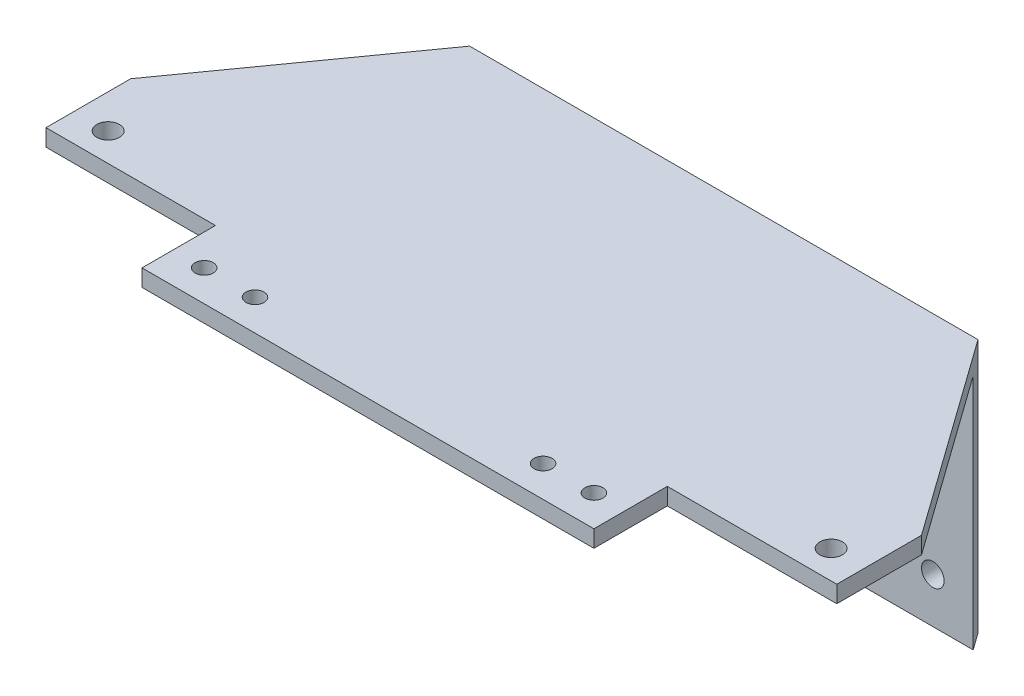
ISO-10303-21;
HEADER;
FILE_DESCRIPTION(('STEP AP214'),'2;1');
FILE_NAME('part.step','',(''),(''),'','','');
FILE_SCHEMA(('AUTOMOTIVE_DESIGN { 1 0 10303 214 1 1 1 1 }'));
ENDSEC;
DATA;
#1=APPLICATION_CONTEXT('core data for automotive mechanical design processes');
#2=APPLICATION_PROTOCOL_DEFINITION('international standard','automotive_design',2000,#1);
#3=PRODUCT_CONTEXT('',#1,'mechanical');
#4=PRODUCT('Part','Part','',(#3));
#5=PRODUCT_RELATED_PRODUCT_CATEGORY('part','',(#4));
#6=PRODUCT_DEFINITION_FORMATION('','',#4);
#7=PRODUCT_DEFINITION_CONTEXT('part definition',#1,'design');
#8=PRODUCT_DEFINITION('design','',#6,#7);
#9=PRODUCT_DEFINITION_SHAPE('','',#8);
#10=(LENGTH_UNIT() NAMED_UNIT(*) SI_UNIT(.MILLI.,.METRE.));
#11=(NAMED_UNIT(*) PLANE_ANGLE_UNIT() SI_UNIT($,.RADIAN.));
#12=(NAMED_UNIT(*) SI_UNIT($,.STERADIAN.) SOLID_ANGLE_UNIT());
#13=UNCERTAINTY_MEASURE_WITH_UNIT(LENGTH_MEASURE(1.E-05),#10,'distance_accuracy_value','');
#14=(GEOMETRIC_REPRESENTATION_CONTEXT(3) GLOBAL_UNCERTAINTY_ASSIGNED_CONTEXT((#13)) GLOBAL_UNIT_ASSIGNED_CONTEXT((#10,
#11,#12)) REPRESENTATION_CONTEXT('',''));
#15=CARTESIAN_POINT('',(0.,0.,0.));
#16=DIRECTION('',(0.,0.,1.));
#17=DIRECTION('',(1.,0.,0.));
#18=AXIS2_PLACEMENT_3D('',#15,#16,#17);
#19=CARTESIAN_POINT('',(140.,22.5,25.));
#20=DIRECTION('',(0.,0.,-1.));
#21=DIRECTION('',(-1.,0.,0.));
#22=AXIS2_PLACEMENT_3D('',#19,#20,#21);
#23=PLANE('',#22);
#24=DIRECTION('',(0.,1.,0.));
#25=VECTOR('',#24,1.);
#26=CARTESIAN_POINT('',(110.,22.5,25.));
#27=LINE('',#26,#25);
#28=CARTESIAN_POINT('',(110.,19.5,25.));
#29=VERTEX_POINT('',#28);
#30=CARTESIAN_POINT('',(110.,22.5,25.));
#31=VERTEX_POINT('',#30);
#32=EDGE_CURVE('E171',#29,#31,#27,.T.);
#33=ORIENTED_EDGE('',*,*,#32,.F.);
#34=DIRECTION('',(-1.,0.,0.));
#35=VECTOR('',#34,1.);
#36=CARTESIAN_POINT('',(140.,19.5,25.));
#37=LINE('',#36,#35);
#38=CARTESIAN_POINT('',(140.,19.5,25.));
#39=VERTEX_POINT('',#38);
#40=EDGE_CURVE('E302',#39,#29,#37,.T.);
#41=ORIENTED_EDGE('',*,*,#40,.F.);
#42=DIRECTION('',(0.,-1.,0.));
#43=VECTOR('',#42,1.);
#44=CARTESIAN_POINT('',(140.,22.5,25.));
#45=LINE('',#44,#43);
#46=CARTESIAN_POINT('',(140.,22.5,25.));
#47=VERTEX_POINT('',#46);
#48=EDGE_CURVE('E271',#47,#39,#45,.T.);
#49=ORIENTED_EDGE('',*,*,#48,.F.);
#50=DIRECTION('',(-1.,0.,0.));
#51=VECTOR('',#50,1.);
#52=CARTESIAN_POINT('',(140.,22.5,25.));
#53=LINE('',#52,#51);
#54=EDGE_CURVE('E63',#47,#31,#53,.T.);
#55=ORIENTED_EDGE('',*,*,#54,.T.);
#56=EDGE_LOOP('',(#33,#41,#49,#55));
#57=FACE_BOUND('',#56,.T.);
#58=ADVANCED_FACE('F39',(#57),#23,.F.);
#59=DIRECTION('',(0.,-1.,0.));
#60=VECTOR('',#59,1.);
#61=CARTESIAN_POINT('',(30.,22.5,25.));
#62=LINE('',#61,#60);
#63=CARTESIAN_POINT('',(30.,22.5,25.));
#64=VERTEX_POINT('',#63);
#65=CARTESIAN_POINT('',(30.,19.5,25.));
#66=VERTEX_POINT('',#65);
#67=EDGE_CURVE('E55',#64,#66,#62,.T.);
#68=ORIENTED_EDGE('',*,*,#67,.F.);
#69=CARTESIAN_POINT('',(0.,22.5,25.));
#70=VERTEX_POINT('',#69);
#71=EDGE_CURVE('E306',#64,#70,#53,.T.);
#72=ORIENTED_EDGE('',*,*,#71,.T.);
#73=DIRECTION('',(0.,-1.,0.));
#74=VECTOR('',#73,1.);
#75=CARTESIAN_POINT('',(0.,22.5,25.));
#76=LINE('',#75,#74);
#77=CARTESIAN_POINT('',(0.,19.5,25.));
#78=VERTEX_POINT('',#77);
#79=EDGE_CURVE('E283',#70,#78,#76,.T.);
#80=ORIENTED_EDGE('',*,*,#79,.T.);
#81=EDGE_CURVE('E301',#66,#78,#37,.T.);
#82=ORIENTED_EDGE('',*,*,#81,.F.);
#83=EDGE_LOOP('',(#68,#72,#80,#82));
#84=FACE_BOUND('',#83,.T.);
#85=ADVANCED_FACE('F354',(#84),#23,.F.);
#86=CARTESIAN_POINT('',(140.,-22.5,-25.));
#87=DIRECTION('',(0.,0.,1.));
#88=DIRECTION('',(1.,0.,0.));
#89=AXIS2_PLACEMENT_3D('',#86,#87,#88);
#90=PLANE('',#89);
#91=CARTESIAN_POINT('',(110.,-14.5,-25.));
#92=DIRECTION('',(0.,0.,-1.));
#93=DIRECTION('',(-1.,0.,0.));
#94=AXIS2_PLACEMENT_3D('',#91,#92,#93);
#95=CIRCLE('',#94,2.);
#96=CARTESIAN_POINT('',(108.,-14.5,-25.));
#97=VERTEX_POINT('',#96);
#98=EDGE_CURVE('E252',#97,#97,#95,.T.);
#99=ORIENTED_EDGE('',*,*,#98,.F.);
#100=EDGE_LOOP('',(#99));
#101=FACE_BOUND('',#100,.T.);
#102=CARTESIAN_POINT('',(30.,-14.5,-25.));
#103=DIRECTION('',(0.,0.,-1.));
#104=DIRECTION('',(-1.,0.,0.));
#105=AXIS2_PLACEMENT_3D('',#102,#103,#104);
#106=CIRCLE('',#105,2.);
#107=CARTESIAN_POINT('',(28.,-14.5,-25.));
#108=VERTEX_POINT('',#107);
#109=EDGE_CURVE('E245',#108,#108,#106,.T.);
#110=ORIENTED_EDGE('',*,*,#109,.F.);
#111=EDGE_LOOP('',(#110));
#112=FACE_BOUND('',#111,.T.);
#113=DIRECTION('',(0.,1.,0.));
#114=VECTOR('',#113,1.);
#115=CARTESIAN_POINT('',(25.,-22.5,-25.));
#116=LINE('',#115,#114);
#117=CARTESIAN_POINT('',(25.,-22.5,-25.));
#118=VERTEX_POINT('',#117);
#119=CARTESIAN_POINT('',(25.,22.5,-25.));
#120=VERTEX_POINT('',#119);
#121=EDGE_CURVE('E202',#118,#120,#116,.T.);
#122=ORIENTED_EDGE('',*,*,#121,.T.);
#123=DIRECTION('',(-1.,0.,0.));
#124=VECTOR('',#123,1.);
#125=CARTESIAN_POINT('',(140.,22.5,-25.));
#126=LINE('',#125,#124);
#127=CARTESIAN_POINT('',(115.,22.5,-25.));
#128=VERTEX_POINT('',#127);
#129=EDGE_CURVE('E309',#128,#120,#126,.T.);
#130=ORIENTED_EDGE('',*,*,#129,.F.);
#131=DIRECTION('',(0.,1.,0.));
#132=VECTOR('',#131,1.);
#133=CARTESIAN_POINT('',(115.,-22.5,-25.));
#134=LINE('',#133,#132);
#135=CARTESIAN_POINT('',(115.,-22.5,-25.));
#136=VERTEX_POINT('',#135);
#137=EDGE_CURVE('E207',#136,#128,#134,.T.);
#138=ORIENTED_EDGE('',*,*,#137,.F.);
#139=DIRECTION('',(-1.,0.,0.));
#140=VECTOR('',#139,1.);
#141=CARTESIAN_POINT('',(140.,-22.5,-25.));
#142=LINE('',#141,#140);
#143=EDGE_CURVE('E279',#136,#118,#142,.T.);
#144=ORIENTED_EDGE('',*,*,#143,.T.);
#145=EDGE_LOOP('',(#122,#130,#138,#144));
#146=FACE_BOUND('',#145,.T.);
#147=ADVANCED_FACE('F41',(#101,#112,#146),#90,.F.);
#148=CARTESIAN_POINT('',(140.,22.5,-25.));
#149=DIRECTION('',(0.,-1.,0.));
#150=DIRECTION('',(0.,0.,-1.));
#151=AXIS2_PLACEMENT_3D('',#148,#149,#150);
#152=PLANE('',#151);
#153=CARTESIAN_POINT('',(35.5,22.5,32.5));
#154=DIRECTION('',(0.,1.,0.));
#155=DIRECTION('',(0.,0.,1.));
#156=AXIS2_PLACEMENT_3D('',#153,#154,#155);
#157=CIRCLE('',#156,1.6);
#158=CARTESIAN_POINT('',(35.5,22.5,34.1));
#159=VERTEX_POINT('',#158);
#160=EDGE_CURVE('E373',#159,#159,#157,.T.);
#161=ORIENTED_EDGE('',*,*,#160,.F.);
#162=EDGE_LOOP('',(#161));
#163=FACE_BOUND('',#162,.T.);
#164=CARTESIAN_POINT('',(44.5,22.5,32.5));
#165=DIRECTION('',(0.,1.,0.));
#166=DIRECTION('',(0.,0.,-1.));
#167=AXIS2_PLACEMENT_3D('',#164,#165,#166);
#168=CIRCLE('',#167,1.6);
#169=CARTESIAN_POINT('',(44.5,22.5,34.1));
#170=VERTEX_POINT('',#169);
#171=EDGE_CURVE('E377',#170,#170,#168,.T.);
#172=ORIENTED_EDGE('',*,*,#171,.F.);
#173=EDGE_LOOP('',(#172));
#174=FACE_BOUND('',#173,.T.);
#175=CARTESIAN_POINT('',(95.5,22.5,32.5));
#176=DIRECTION('',(0.,1.,0.));
#177=DIRECTION('',(0.,0.,1.));
#178=AXIS2_PLACEMENT_3D('',#175,#176,#177);
#179=CIRCLE('',#178,1.6);
#180=CARTESIAN_POINT('',(95.5,22.5,34.1));
#181=VERTEX_POINT('',#180);
#182=EDGE_CURVE('E381',#181,#181,#179,.T.);
#183=ORIENTED_EDGE('',*,*,#182,.F.);
#184=EDGE_LOOP('',(#183));
#185=FACE_BOUND('',#184,.T.);
#186=CARTESIAN_POINT('',(104.5,22.5,32.5));
#187=DIRECTION('',(0.,1.,0.));
#188=DIRECTION('',(0.,0.,-1.));
#189=AXIS2_PLACEMENT_3D('',#186,#187,#188);
#190=CIRCLE('',#189,1.59999999999999);
#191=CARTESIAN_POINT('',(104.5,22.5,34.1));
#192=VERTEX_POINT('',#191);
#193=EDGE_CURVE('E384',#192,#192,#190,.T.);
#194=ORIENTED_EDGE('',*,*,#193,.F.);
#195=EDGE_LOOP('',(#194));
#196=FACE_BOUND('',#195,.T.);
#197=ORIENTED_EDGE('',*,*,#129,.T.);
#198=DIRECTION('',(0.581238193719096,0.,-0.813733471206735));
#199=VECTOR('',#198,1.);
#200=CARTESIAN_POINT('',(0.,22.5,10.));
#201=LINE('',#200,#199);
#202=CARTESIAN_POINT('',(0.,22.5,10.));
#203=VERTEX_POINT('',#202);
#204=EDGE_CURVE('E203',#203,#120,#201,.T.);
#205=ORIENTED_EDGE('',*,*,#204,.F.);
#206=DIRECTION('',(0.,0.,1.));
#207=VECTOR('',#206,1.);
#208=CARTESIAN_POINT('',(0.,22.5,-25.));
#209=LINE('',#208,#207);
#210=EDGE_CURVE('E261',#203,#70,#209,.T.);
#211=ORIENTED_EDGE('',*,*,#210,.T.);
#212=ORIENTED_EDGE('',*,*,#71,.F.);
#213=DIRECTION('',(0.,0.,-1.));
#214=VECTOR('',#213,1.);
#215=CARTESIAN_POINT('',(30.,22.5,38.));
#216=LINE('',#215,#214);
#217=CARTESIAN_POINT('',(30.,22.5,38.));
#218=VERTEX_POINT('',#217);
#219=EDGE_CURVE('E154',#218,#64,#216,.T.);
#220=ORIENTED_EDGE('',*,*,#219,.F.);
#221=DIRECTION('',(-1.,0.,0.));
#222=VECTOR('',#221,1.);
#223=CARTESIAN_POINT('',(30.,22.5,38.));
#224=LINE('',#223,#222);
#225=CARTESIAN_POINT('',(110.,22.5,38.));
#226=VERTEX_POINT('',#225);
#227=EDGE_CURVE('E146',#226,#218,#224,.T.);
#228=ORIENTED_EDGE('',*,*,#227,.F.);
#229=DIRECTION('',(0.,0.,-1.));
#230=VECTOR('',#229,1.);
#231=CARTESIAN_POINT('',(110.,22.5,38.));
#232=LINE('',#231,#230);
#233=EDGE_CURVE('E151',#226,#31,#232,.T.);
#234=ORIENTED_EDGE('',*,*,#233,.T.);
#235=ORIENTED_EDGE('',*,*,#54,.F.);
#236=DIRECTION('',(0.,0.,1.));
#237=VECTOR('',#236,1.);
#238=CARTESIAN_POINT('',(140.,22.5,-25.));
#239=LINE('',#238,#237);
#240=CARTESIAN_POINT('',(140.,22.5,10.));
#241=VERTEX_POINT('',#240);
#242=EDGE_CURVE('E268',#241,#47,#239,.T.);
#243=ORIENTED_EDGE('',*,*,#242,.F.);
#244=DIRECTION('',(0.581238193719096,0.,0.813733471206735));
#245=VECTOR('',#244,1.);
#246=CARTESIAN_POINT('',(115.,22.5,-25.));
#247=LINE('',#246,#245);
#248=EDGE_CURVE('E197',#128,#241,#247,.T.);
#249=ORIENTED_EDGE('',*,*,#248,.F.);
#250=EDGE_LOOP('',(#197,#205,#211,#212,#220,#228,#234,#235,#243,#249));
#251=FACE_BOUND('',#250,.T.);
#252=CARTESIAN_POINT('',(6.00000000000001,22.5,20.));
#253=DIRECTION('',(0.,1.,0.));
#254=DIRECTION('',(0.,0.,1.));
#255=AXIS2_PLACEMENT_3D('',#252,#253,#254);
#256=CIRCLE('',#255,2.);
#257=CARTESIAN_POINT('',(6.00000000000001,22.5,22.));
#258=VERTEX_POINT('',#257);
#259=EDGE_CURVE('E236',#258,#258,#256,.T.);
#260=ORIENTED_EDGE('',*,*,#259,.F.);
#261=EDGE_LOOP('',(#260));
#262=FACE_BOUND('',#261,.T.);
#263=CARTESIAN_POINT('',(134.,22.5,20.));
#264=DIRECTION('',(0.,1.,0.));
#265=DIRECTION('',(0.,0.,1.));
#266=AXIS2_PLACEMENT_3D('',#263,#264,#265);
#267=CIRCLE('',#266,2.);
#268=CARTESIAN_POINT('',(134.,22.5,22.));
#269=VERTEX_POINT('',#268);
#270=EDGE_CURVE('E235',#269,#269,#267,.T.);
#271=ORIENTED_EDGE('',*,*,#270,.F.);
#272=EDGE_LOOP('',(#271));
#273=FACE_BOUND('',#272,.T.);
#274=ADVANCED_FACE('F148',(#163,#174,#185,#196,#251,#262,#273),#152,.F.);
#275=CARTESIAN_POINT('',(140.,19.5,25.));
#276=DIRECTION('',(0.,1.,0.));
#277=DIRECTION('',(0.,0.,1.));
#278=AXIS2_PLACEMENT_3D('',#275,#276,#277);
#279=PLANE('',#278);
#280=CARTESIAN_POINT('',(35.5,19.5,32.5));
#281=DIRECTION('',(0.,1.,0.));
#282=DIRECTION('',(0.,0.,1.));
#283=AXIS2_PLACEMENT_3D('',#280,#281,#282);
#284=CIRCLE('',#283,1.6);
#285=CARTESIAN_POINT('',(35.5,19.5,34.1));
#286=VERTEX_POINT('',#285);
#287=EDGE_CURVE('E403',#286,#286,#284,.F.);
#288=ORIENTED_EDGE('',*,*,#287,.F.);
#289=EDGE_LOOP('',(#288));
#290=FACE_BOUND('',#289,.T.);
#291=CARTESIAN_POINT('',(44.5,19.5,32.5));
#292=DIRECTION('',(0.,1.,0.));
#293=DIRECTION('',(0.,0.,1.));
#294=AXIS2_PLACEMENT_3D('',#291,#292,#293);
#295=CIRCLE('',#294,1.6);
#296=CARTESIAN_POINT('',(44.5,19.5,34.1));
#297=VERTEX_POINT('',#296);
#298=EDGE_CURVE('E439',#297,#297,#295,.F.);
#299=ORIENTED_EDGE('',*,*,#298,.F.);
#300=EDGE_LOOP('',(#299));
#301=FACE_BOUND('',#300,.T.);
#302=CARTESIAN_POINT('',(95.5,19.5,32.5));
#303=DIRECTION('',(0.,1.,0.));
#304=DIRECTION('',(0.,0.,1.));
#305=AXIS2_PLACEMENT_3D('',#302,#303,#304);
#306=CIRCLE('',#305,1.6);
#307=CARTESIAN_POINT('',(95.5,19.5,34.1));
#308=VERTEX_POINT('',#307);
#309=EDGE_CURVE('E393',#308,#308,#306,.F.);
#310=ORIENTED_EDGE('',*,*,#309,.F.);
#311=EDGE_LOOP('',(#310));
#312=FACE_BOUND('',#311,.T.);
#313=CARTESIAN_POINT('',(104.5,19.5,32.5));
#314=DIRECTION('',(0.,1.,0.));
#315=DIRECTION('',(0.,0.,1.));
#316=AXIS2_PLACEMENT_3D('',#313,#314,#315);
#317=CIRCLE('',#316,1.59999999999999);
#318=CARTESIAN_POINT('',(104.5,19.5,34.1));
#319=VERTEX_POINT('',#318);
#320=EDGE_CURVE('E387',#319,#319,#317,.F.);
#321=ORIENTED_EDGE('',*,*,#320,.F.);
#322=EDGE_LOOP('',(#321));
#323=FACE_BOUND('',#322,.T.);
#324=CARTESIAN_POINT('',(6.00000000000001,19.5,20.));
#325=DIRECTION('',(0.,1.,0.));
#326=DIRECTION('',(0.,0.,1.));
#327=AXIS2_PLACEMENT_3D('',#324,#325,#326);
#328=CIRCLE('',#327,2.);
#329=CARTESIAN_POINT('',(6.00000000000001,19.5,22.));
#330=VERTEX_POINT('',#329);
#331=EDGE_CURVE('E240',#330,#330,#328,.F.);
#332=ORIENTED_EDGE('',*,*,#331,.F.);
#333=EDGE_LOOP('',(#332));
#334=FACE_BOUND('',#333,.T.);
#335=CARTESIAN_POINT('',(134.,19.5,20.));
#336=DIRECTION('',(0.,1.,0.));
#337=DIRECTION('',(0.,0.,1.));
#338=AXIS2_PLACEMENT_3D('',#335,#336,#337);
#339=CIRCLE('',#338,2.);
#340=CARTESIAN_POINT('',(134.,19.5,22.));
#341=VERTEX_POINT('',#340);
#342=EDGE_CURVE('E241',#341,#341,#339,.F.);
#343=ORIENTED_EDGE('',*,*,#342,.F.);
#344=EDGE_LOOP('',(#343));
#345=FACE_BOUND('',#344,.T.);
#346=DIRECTION('',(-1.,0.,0.));
#347=VECTOR('',#346,1.);
#348=CARTESIAN_POINT('',(140.,19.5,-22.));
#349=LINE('',#348,#347);
#350=CARTESIAN_POINT('',(65.,19.5,-22.));
#351=VERTEX_POINT('',#350);
#352=CARTESIAN_POINT('',(22.8571428571429,19.5,-22.));
#353=VERTEX_POINT('',#352);
#354=EDGE_CURVE('E297',#351,#353,#349,.T.);
#355=ORIENTED_EDGE('',*,*,#354,.F.);
#356=DIRECTION('',(0.,0.,1.));
#357=VECTOR('',#356,1.);
#358=CARTESIAN_POINT('',(65.,19.5,25.));
#359=LINE('',#358,#357);
#360=CARTESIAN_POINT('',(65.,19.5,8.232800982801));
#361=VERTEX_POINT('',#360);
#362=EDGE_CURVE('E191',#351,#361,#359,.T.);
#363=ORIENTED_EDGE('',*,*,#362,.T.);
#364=DIRECTION('',(1.,0.,0.));
#365=VECTOR('',#364,1.);
#366=CARTESIAN_POINT('',(140.,19.5,8.232800982801));
#367=LINE('',#366,#365);
#368=CARTESIAN_POINT('',(75.,19.5,8.23280098280098));
#369=VERTEX_POINT('',#368);
#370=EDGE_CURVE('E194',#361,#369,#367,.T.);
#371=ORIENTED_EDGE('',*,*,#370,.T.);
#372=DIRECTION('',(0.,0.,1.));
#373=VECTOR('',#372,1.);
#374=CARTESIAN_POINT('',(75.,19.5,25.));
#375=LINE('',#374,#373);
#376=CARTESIAN_POINT('',(75.,19.5,-22.));
#377=VERTEX_POINT('',#376);
#378=EDGE_CURVE('E186',#377,#369,#375,.T.);
#379=ORIENTED_EDGE('',*,*,#378,.F.);
#380=CARTESIAN_POINT('',(117.142857142857,19.5,-22.));
#381=VERTEX_POINT('',#380);
#382=EDGE_CURVE('E298',#381,#377,#349,.T.);
#383=ORIENTED_EDGE('',*,*,#382,.F.);
#384=DIRECTION('',(0.581238193719096,0.,0.813733471206735));
#385=VECTOR('',#384,1.);
#386=CARTESIAN_POINT('',(147.094594594595,19.5,19.9324324324324));
#387=LINE('',#386,#385);
#388=CARTESIAN_POINT('',(140.,19.5,10.));
#389=VERTEX_POINT('',#388);
#390=EDGE_CURVE('E231',#381,#389,#387,.T.);
#391=ORIENTED_EDGE('',*,*,#390,.T.);
#392=DIRECTION('',(0.,0.,-1.));
#393=VECTOR('',#392,1.);
#394=CARTESIAN_POINT('',(140.,19.5,25.));
#395=LINE('',#394,#393);
#396=EDGE_CURVE('E275',#39,#389,#395,.T.);
#397=ORIENTED_EDGE('',*,*,#396,.F.);
#398=ORIENTED_EDGE('',*,*,#40,.T.);
#399=DIRECTION('',(0.,0.,-1.));
#400=VECTOR('',#399,1.);
#401=CARTESIAN_POINT('',(110.,19.5,38.));
#402=LINE('',#401,#400);
#403=CARTESIAN_POINT('',(110.,19.5,38.));
#404=VERTEX_POINT('',#403);
#405=EDGE_CURVE('E400',#404,#29,#402,.T.);
#406=ORIENTED_EDGE('',*,*,#405,.F.);
#407=DIRECTION('',(1.,0.,0.));
#408=VECTOR('',#407,1.);
#409=CARTESIAN_POINT('',(30.,19.5,38.));
#410=LINE('',#409,#408);
#411=CARTESIAN_POINT('',(30.,19.5,38.));
#412=VERTEX_POINT('',#411);
#413=EDGE_CURVE('E164',#412,#404,#410,.T.);
#414=ORIENTED_EDGE('',*,*,#413,.F.);
#415=DIRECTION('',(0.,0.,-1.));
#416=VECTOR('',#415,1.);
#417=CARTESIAN_POINT('',(30.,19.5,38.));
#418=LINE('',#417,#416);
#419=EDGE_CURVE('E180',#412,#66,#418,.T.);
#420=ORIENTED_EDGE('',*,*,#419,.T.);
#421=ORIENTED_EDGE('',*,*,#81,.T.);
#422=DIRECTION('',(0.,0.,-1.));
#423=VECTOR('',#422,1.);
#424=CARTESIAN_POINT('',(0.,19.5,25.));
#425=LINE('',#424,#423);
#426=CARTESIAN_POINT('',(0.,19.5,10.));
#427=VERTEX_POINT('',#426);
#428=EDGE_CURVE('E272',#78,#427,#425,.T.);
#429=ORIENTED_EDGE('',*,*,#428,.T.);
#430=DIRECTION('',(0.581238193719096,0.,-0.813733471206735));
#431=VECTOR('',#430,1.);
#432=CARTESIAN_POINT('',(40.2027027027027,19.5,-46.2837837837838));
#433=LINE('',#432,#431);
#434=EDGE_CURVE('E223',#427,#353,#433,.T.);
#435=ORIENTED_EDGE('',*,*,#434,.T.);
#436=EDGE_LOOP('',(#355,#363,#371,#379,#383,#391,#397,#398,#406,#414,#420,#421,#429,#435));
#437=FACE_BOUND('',#436,.T.);
#438=ADVANCED_FACE('F338',(#290,#301,#312,#323,#334,#345,#437),#279,.F.);
#439=CARTESIAN_POINT('',(140.,19.5,-22.));
#440=DIRECTION('',(0.,0.,-1.));
#441=DIRECTION('',(0.,1.,0.));
#442=AXIS2_PLACEMENT_3D('',#439,#440,#441);
#443=PLANE('',#442);
#444=CARTESIAN_POINT('',(110.,-14.5,-22.));
#445=DIRECTION('',(0.,0.,-1.));
#446=DIRECTION('',(0.,1.,0.));
#447=AXIS2_PLACEMENT_3D('',#444,#445,#446);
#448=CIRCLE('',#447,2.);
#449=CARTESIAN_POINT('',(110.,-12.5,-22.));
#450=VERTEX_POINT('',#449);
#451=EDGE_CURVE('E256',#450,#450,#448,.F.);
#452=ORIENTED_EDGE('',*,*,#451,.F.);
#453=EDGE_LOOP('',(#452));
#454=FACE_BOUND('',#453,.T.);
#455=CARTESIAN_POINT('',(30.,-14.5,-22.));
#456=DIRECTION('',(0.,0.,-1.));
#457=DIRECTION('',(0.,1.,0.));
#458=AXIS2_PLACEMENT_3D('',#455,#456,#457);
#459=CIRCLE('',#458,2.);
#460=CARTESIAN_POINT('',(30.,-12.5,-22.));
#461=VERTEX_POINT('',#460);
#462=EDGE_CURVE('E257',#461,#461,#459,.F.);
#463=ORIENTED_EDGE('',*,*,#462,.F.);
#464=EDGE_LOOP('',(#463));
#465=FACE_BOUND('',#464,.T.);
#466=DIRECTION('',(-1.,0.,0.));
#467=VECTOR('',#466,1.);
#468=CARTESIAN_POINT('',(140.,-4.89390356265356,-22.));
#469=LINE('',#468,#467);
#470=CARTESIAN_POINT('',(75.,-4.89390356265356,-22.));
#471=VERTEX_POINT('',#470);
#472=CARTESIAN_POINT('',(65.,-4.89390356265356,-22.));
#473=VERTEX_POINT('',#472);
#474=EDGE_CURVE('E48',#471,#473,#469,.T.);
#475=ORIENTED_EDGE('',*,*,#474,.T.);
#476=DIRECTION('',(0.,1.,0.));
#477=VECTOR('',#476,1.);
#478=CARTESIAN_POINT('',(65.,19.5,-22.));
#479=LINE('',#478,#477);
#480=EDGE_CURVE('E11',#473,#351,#479,.T.);
#481=ORIENTED_EDGE('',*,*,#480,.T.);
#482=ORIENTED_EDGE('',*,*,#354,.T.);
#483=DIRECTION('',(0.,-1.,0.));
#484=VECTOR('',#483,1.);
#485=CARTESIAN_POINT('',(22.8571428571429,19.5,-22.));
#486=LINE('',#485,#484);
#487=CARTESIAN_POINT('',(22.8571428571429,-22.5,-22.));
#488=VERTEX_POINT('',#487);
#489=EDGE_CURVE('E211',#353,#488,#486,.T.);
#490=ORIENTED_EDGE('',*,*,#489,.T.);
#491=DIRECTION('',(-1.,0.,0.));
#492=VECTOR('',#491,1.);
#493=CARTESIAN_POINT('',(140.,-22.5,-22.));
#494=LINE('',#493,#492);
#495=CARTESIAN_POINT('',(117.142857142857,-22.5,-22.));
#496=VERTEX_POINT('',#495);
#497=EDGE_CURVE('E293',#496,#488,#494,.T.);
#498=ORIENTED_EDGE('',*,*,#497,.F.);
#499=DIRECTION('',(0.,1.,0.));
#500=VECTOR('',#499,1.);
#501=CARTESIAN_POINT('',(117.142857142857,19.5,-22.));
#502=LINE('',#501,#500);
#503=EDGE_CURVE('E227',#496,#381,#502,.T.);
#504=ORIENTED_EDGE('',*,*,#503,.T.);
#505=ORIENTED_EDGE('',*,*,#382,.T.);
#506=DIRECTION('',(0.,1.,0.));
#507=VECTOR('',#506,1.);
#508=CARTESIAN_POINT('',(75.,19.5,-22.));
#509=LINE('',#508,#507);
#510=EDGE_CURVE('E319',#471,#377,#509,.T.);
#511=ORIENTED_EDGE('',*,*,#510,.F.);
#512=EDGE_LOOP('',(#475,#481,#482,#490,#498,#504,#505,#511));
#513=FACE_BOUND('',#512,.T.);
#514=ADVANCED_FACE('F326',(#454,#465,#513),#443,.F.);
#515=CARTESIAN_POINT('',(140.,-22.5,-22.));
#516=DIRECTION('',(0.,1.,0.));
#517=DIRECTION('',(0.,0.,1.));
#518=AXIS2_PLACEMENT_3D('',#515,#516,#517);
#519=PLANE('',#518);
#520=ORIENTED_EDGE('',*,*,#497,.T.);
#521=DIRECTION('',(0.581238193719096,0.,-0.813733471206735));
#522=VECTOR('',#521,1.);
#523=CARTESIAN_POINT('',(0.,-22.5,10.));
#524=LINE('',#523,#522);
#525=EDGE_CURVE('E198',#488,#118,#524,.T.);
#526=ORIENTED_EDGE('',*,*,#525,.T.);
#527=ORIENTED_EDGE('',*,*,#143,.F.);
#528=DIRECTION('',(0.581238193719096,0.,0.813733471206735));
#529=VECTOR('',#528,1.);
#530=CARTESIAN_POINT('',(115.,-22.5,-25.));
#531=LINE('',#530,#529);
#532=EDGE_CURVE('E212',#136,#496,#531,.T.);
#533=ORIENTED_EDGE('',*,*,#532,.T.);
#534=EDGE_LOOP('',(#520,#526,#527,#533));
#535=FACE_BOUND('',#534,.T.);
#536=ADVANCED_FACE('F486',(#535),#519,.F.);
#537=CARTESIAN_POINT('',(140.,0.,0.));
#538=DIRECTION('',(1.,0.,0.));
#539=DIRECTION('',(0.,0.,-1.));
#540=AXIS2_PLACEMENT_3D('',#537,#538,#539);
#541=PLANE('',#540);
#542=DIRECTION('',(0.,-1.,0.));
#543=VECTOR('',#542,1.);
#544=CARTESIAN_POINT('',(140.,0.,10.));
#545=LINE('',#544,#543);
#546=EDGE_CURVE('E316',#241,#389,#545,.T.);
#547=ORIENTED_EDGE('',*,*,#546,.F.);
#548=ORIENTED_EDGE('',*,*,#242,.T.);
#549=ORIENTED_EDGE('',*,*,#48,.T.);
#550=ORIENTED_EDGE('',*,*,#396,.T.);
#551=EDGE_LOOP('',(#547,#548,#549,#550));
#552=FACE_BOUND('',#551,.T.);
#553=ADVANCED_FACE('F483',(#552),#541,.T.);
#554=CARTESIAN_POINT('',(0.,0.,0.));
#555=DIRECTION('',(1.,0.,0.));
#556=DIRECTION('',(0.,0.,-1.));
#557=AXIS2_PLACEMENT_3D('',#554,#555,#556);
#558=PLANE('',#557);
#559=ORIENTED_EDGE('',*,*,#210,.F.);
#560=DIRECTION('',(0.,-1.,0.));
#561=VECTOR('',#560,1.);
#562=CARTESIAN_POINT('',(0.,0.,10.));
#563=LINE('',#562,#561);
#564=EDGE_CURVE('E312',#203,#427,#563,.T.);
#565=ORIENTED_EDGE('',*,*,#564,.T.);
#566=ORIENTED_EDGE('',*,*,#428,.F.);
#567=ORIENTED_EDGE('',*,*,#79,.F.);
#568=EDGE_LOOP('',(#559,#565,#566,#567));
#569=FACE_BOUND('',#568,.T.);
#570=ADVANCED_FACE('F481',(#569),#558,.F.);
#571=CARTESIAN_POINT('',(30.,-14.5,25.001));
#572=DIRECTION('',(0.,0.,-1.));
#573=DIRECTION('',(-1.,0.,0.));
#574=AXIS2_PLACEMENT_3D('',#571,#572,#573);
#575=CYLINDRICAL_SURFACE('',#574,2.);
#576=ORIENTED_EDGE('',*,*,#109,.T.);
#577=EDGE_LOOP('',(#576));
#578=FACE_BOUND('',#577,.T.);
#579=ORIENTED_EDGE('',*,*,#462,.T.);
#580=EDGE_LOOP('',(#579));
#581=FACE_BOUND('',#580,.T.);
#582=ADVANCED_FACE('F474',(#578,#581),#575,.F.);
#583=CARTESIAN_POINT('',(110.,-14.5,25.001));
#584=DIRECTION('',(0.,0.,-1.));
#585=DIRECTION('',(-1.,0.,0.));
#586=AXIS2_PLACEMENT_3D('',#583,#584,#585);
#587=CYLINDRICAL_SURFACE('',#586,2.);
#588=ORIENTED_EDGE('',*,*,#98,.T.);
#589=EDGE_LOOP('',(#588));
#590=FACE_BOUND('',#589,.T.);
#591=ORIENTED_EDGE('',*,*,#451,.T.);
#592=EDGE_LOOP('',(#591));
#593=FACE_BOUND('',#592,.T.);
#594=ADVANCED_FACE('F464',(#590,#593),#587,.F.);
#595=CARTESIAN_POINT('',(134.,-22.501,20.));
#596=DIRECTION('',(0.,1.,0.));
#597=DIRECTION('',(0.,0.,1.));
#598=AXIS2_PLACEMENT_3D('',#595,#596,#597);
#599=CYLINDRICAL_SURFACE('',#598,2.);
#600=ORIENTED_EDGE('',*,*,#270,.T.);
#601=EDGE_LOOP('',(#600));
#602=FACE_BOUND('',#601,.T.);
#603=ORIENTED_EDGE('',*,*,#342,.T.);
#604=EDGE_LOOP('',(#603));
#605=FACE_BOUND('',#604,.T.);
#606=ADVANCED_FACE('F461',(#602,#605),#599,.F.);
#607=CARTESIAN_POINT('',(6.00000000000001,-22.501,20.));
#608=DIRECTION('',(0.,1.,0.));
#609=DIRECTION('',(0.,0.,1.));
#610=AXIS2_PLACEMENT_3D('',#607,#608,#609);
#611=CYLINDRICAL_SURFACE('',#610,2.);
#612=ORIENTED_EDGE('',*,*,#259,.T.);
#613=EDGE_LOOP('',(#612));
#614=FACE_BOUND('',#613,.T.);
#615=ORIENTED_EDGE('',*,*,#331,.T.);
#616=EDGE_LOOP('',(#615));
#617=FACE_BOUND('',#616,.T.);
#618=ADVANCED_FACE('F463',(#614,#617),#611,.F.);
#619=CARTESIAN_POINT('',(0.,-22.5,10.));
#620=DIRECTION('',(0.813733471206735,0.,0.581238193719096));
#621=DIRECTION('',(0.581238193719096,0.,-0.813733471206735));
#622=AXIS2_PLACEMENT_3D('',#619,#620,#621);
#623=PLANE('',#622);
#624=ORIENTED_EDGE('',*,*,#564,.F.);
#625=ORIENTED_EDGE('',*,*,#204,.T.);
#626=ORIENTED_EDGE('',*,*,#121,.F.);
#627=ORIENTED_EDGE('',*,*,#525,.F.);
#628=ORIENTED_EDGE('',*,*,#489,.F.);
#629=ORIENTED_EDGE('',*,*,#434,.F.);
#630=EDGE_LOOP('',(#624,#625,#626,#627,#628,#629));
#631=FACE_BOUND('',#630,.T.);
#632=ADVANCED_FACE('F471',(#631),#623,.F.);
#633=CARTESIAN_POINT('',(115.,-22.5,-25.));
#634=DIRECTION('',(-0.813733471206735,0.,0.581238193719096));
#635=DIRECTION('',(0.581238193719096,0.,0.813733471206735));
#636=AXIS2_PLACEMENT_3D('',#633,#634,#635);
#637=PLANE('',#636);
#638=ORIENTED_EDGE('',*,*,#503,.F.);
#639=ORIENTED_EDGE('',*,*,#532,.F.);
#640=ORIENTED_EDGE('',*,*,#137,.T.);
#641=ORIENTED_EDGE('',*,*,#248,.T.);
#642=ORIENTED_EDGE('',*,*,#546,.T.);
#643=ORIENTED_EDGE('',*,*,#390,.F.);
#644=EDGE_LOOP('',(#638,#639,#640,#641,#642,#643));
#645=FACE_BOUND('',#644,.T.);
#646=ADVANCED_FACE('F544',(#645),#637,.F.);
#647=CARTESIAN_POINT('',(70.,-4.89390356265356,-22.));
#648=DIRECTION('',(0.,-0.778254364253167,0.627949157592316));
#649=DIRECTION('',(0.,0.627949157592316,0.778254364253167));
#650=AXIS2_PLACEMENT_3D('',#647,#648,#649);
#651=PLANE('',#650);
#652=ORIENTED_EDGE('',*,*,#370,.F.);
#653=DIRECTION('',(0.,0.627949157592316,0.778254364253167));
#654=VECTOR('',#653,1.);
#655=CARTESIAN_POINT('',(65.,-4.89390356265356,-22.));
#656=LINE('',#655,#654);
#657=EDGE_CURVE('E178',#473,#361,#656,.T.);
#658=ORIENTED_EDGE('',*,*,#657,.F.);
#659=ORIENTED_EDGE('',*,*,#474,.F.);
#660=DIRECTION('',(0.,0.627949157592316,0.778254364253167));
#661=VECTOR('',#660,1.);
#662=CARTESIAN_POINT('',(75.,-4.89390356265356,-22.));
#663=LINE('',#662,#661);
#664=EDGE_CURVE('E173',#471,#369,#663,.T.);
#665=ORIENTED_EDGE('',*,*,#664,.T.);
#666=EDGE_LOOP('',(#652,#658,#659,#665));
#667=FACE_BOUND('',#666,.T.);
#668=ADVANCED_FACE('F335',(#667),#651,.T.);
#669=CARTESIAN_POINT('',(65.,0.,0.));
#670=DIRECTION('',(-1.,0.,0.));
#671=DIRECTION('',(0.,0.,1.));
#672=AXIS2_PLACEMENT_3D('',#669,#670,#671);
#673=PLANE('',#672);
#674=ORIENTED_EDGE('',*,*,#362,.F.);
#675=ORIENTED_EDGE('',*,*,#480,.F.);
#676=ORIENTED_EDGE('',*,*,#657,.T.);
#677=EDGE_LOOP('',(#674,#675,#676));
#678=FACE_BOUND('',#677,.T.);
#679=ADVANCED_FACE('F333',(#678),#673,.T.);
#680=CARTESIAN_POINT('',(75.,0.,0.));
#681=DIRECTION('',(-1.,0.,0.));
#682=DIRECTION('',(0.,0.,1.));
#683=AXIS2_PLACEMENT_3D('',#680,#681,#682);
#684=PLANE('',#683);
#685=ORIENTED_EDGE('',*,*,#510,.T.);
#686=ORIENTED_EDGE('',*,*,#378,.T.);
#687=ORIENTED_EDGE('',*,*,#664,.F.);
#688=EDGE_LOOP('',(#685,#686,#687));
#689=FACE_BOUND('',#688,.T.);
#690=ADVANCED_FACE('F341',(#689),#684,.F.);
#691=CARTESIAN_POINT('',(110.,22.5,38.));
#692=DIRECTION('',(-1.,0.,0.));
#693=DIRECTION('',(0.,0.,1.));
#694=AXIS2_PLACEMENT_3D('',#691,#692,#693);
#695=PLANE('',#694);
#696=ORIENTED_EDGE('',*,*,#32,.T.);
#697=ORIENTED_EDGE('',*,*,#233,.F.);
#698=DIRECTION('',(0.,1.,0.));
#699=VECTOR('',#698,1.);
#700=CARTESIAN_POINT('',(110.,22.5,38.));
#701=LINE('',#700,#699);
#702=EDGE_CURVE('E159',#404,#226,#701,.T.);
#703=ORIENTED_EDGE('',*,*,#702,.F.);
#704=ORIENTED_EDGE('',*,*,#405,.T.);
#705=EDGE_LOOP('',(#696,#697,#703,#704));
#706=FACE_BOUND('',#705,.T.);
#707=ADVANCED_FACE('F170',(#706),#695,.F.);
#708=CARTESIAN_POINT('',(30.,22.5,38.));
#709=DIRECTION('',(1.,0.,0.));
#710=DIRECTION('',(0.,0.,-1.));
#711=AXIS2_PLACEMENT_3D('',#708,#709,#710);
#712=PLANE('',#711);
#713=ORIENTED_EDGE('',*,*,#67,.T.);
#714=ORIENTED_EDGE('',*,*,#419,.F.);
#715=DIRECTION('',(0.,-1.,0.));
#716=VECTOR('',#715,1.);
#717=CARTESIAN_POINT('',(30.,22.5,38.));
#718=LINE('',#717,#716);
#719=EDGE_CURVE('E158',#218,#412,#718,.T.);
#720=ORIENTED_EDGE('',*,*,#719,.F.);
#721=ORIENTED_EDGE('',*,*,#219,.T.);
#722=EDGE_LOOP('',(#713,#714,#720,#721));
#723=FACE_BOUND('',#722,.T.);
#724=ADVANCED_FACE('F349',(#723),#712,.F.);
#725=CARTESIAN_POINT('',(0.,0.,38.));
#726=DIRECTION('',(0.,0.,1.));
#727=DIRECTION('',(1.,0.,0.));
#728=AXIS2_PLACEMENT_3D('',#725,#726,#727);
#729=PLANE('',#728);
#730=ORIENTED_EDGE('',*,*,#702,.T.);
#731=ORIENTED_EDGE('',*,*,#227,.T.);
#732=ORIENTED_EDGE('',*,*,#719,.T.);
#733=ORIENTED_EDGE('',*,*,#413,.T.);
#734=EDGE_LOOP('',(#730,#731,#732,#733));
#735=FACE_BOUND('',#734,.T.);
#736=ADVANCED_FACE('F162',(#735),#729,.T.);
#737=CARTESIAN_POINT('',(104.5,14.9745166004061,32.5));
#738=DIRECTION('',(0.,1.,0.));
#739=DIRECTION('',(0.,0.,1.));
#740=AXIS2_PLACEMENT_3D('',#737,#738,#739);
#741=CYLINDRICAL_SURFACE('',#740,1.59999999999999);
#742=CARTESIAN_POINT('',(104.5,19.5,34.1));
#743=CARTESIAN_POINT('',(104.5,19.53125,34.1));
#744=CARTESIAN_POINT('',(104.5,19.5625,34.1));
#745=CARTESIAN_POINT('',(104.5,19.625,34.1));
#746=CARTESIAN_POINT('',(104.5,19.65625,34.1));
#747=CARTESIAN_POINT('',(104.5,19.71875,34.1));
#748=CARTESIAN_POINT('',(104.5,19.75,34.1));
#749=CARTESIAN_POINT('',(104.5,19.8125,34.1));
#750=CARTESIAN_POINT('',(104.5,19.84375,34.1));
#751=CARTESIAN_POINT('',(104.5,19.90625,34.1));
#752=CARTESIAN_POINT('',(104.5,19.9375,34.1));
#753=CARTESIAN_POINT('',(104.5,20.,34.1));
#754=CARTESIAN_POINT('',(104.5,20.03125,34.1));
#755=CARTESIAN_POINT('',(104.5,20.09375,34.1));
#756=CARTESIAN_POINT('',(104.5,20.125,34.1));
#757=CARTESIAN_POINT('',(104.5,20.1875,34.1));
#758=CARTESIAN_POINT('',(104.5,20.21875,34.1));
#759=CARTESIAN_POINT('',(104.5,20.28125,34.1));
#760=CARTESIAN_POINT('',(104.5,20.3125,34.1));
#761=CARTESIAN_POINT('',(104.5,20.375,34.1));
#762=CARTESIAN_POINT('',(104.5,20.40625,34.1));
#763=CARTESIAN_POINT('',(104.5,20.46875,34.1));
#764=CARTESIAN_POINT('',(104.5,20.5,34.1));
#765=CARTESIAN_POINT('',(104.5,20.5625,34.1));
#766=CARTESIAN_POINT('',(104.5,20.59375,34.1));
#767=CARTESIAN_POINT('',(104.5,20.65625,34.1));
#768=CARTESIAN_POINT('',(104.5,20.6875,34.1));
#769=CARTESIAN_POINT('',(104.5,20.75,34.1));
#770=CARTESIAN_POINT('',(104.5,20.78125,34.1));
#771=CARTESIAN_POINT('',(104.5,20.84375,34.1));
#772=CARTESIAN_POINT('',(104.5,20.875,34.1));
#773=CARTESIAN_POINT('',(104.5,20.9375,34.1));
#774=CARTESIAN_POINT('',(104.5,20.96875,34.1));
#775=CARTESIAN_POINT('',(104.5,21.03125,34.1));
#776=CARTESIAN_POINT('',(104.5,21.0625,34.1));
#777=CARTESIAN_POINT('',(104.5,21.125,34.1));
#778=CARTESIAN_POINT('',(104.5,21.15625,34.1));
#779=CARTESIAN_POINT('',(104.5,21.21875,34.1));
#780=CARTESIAN_POINT('',(104.5,21.25,34.1));
#781=CARTESIAN_POINT('',(104.5,21.3125,34.1));
#782=CARTESIAN_POINT('',(104.5,21.34375,34.1));
#783=CARTESIAN_POINT('',(104.5,21.40625,34.1));
#784=CARTESIAN_POINT('',(104.5,21.4375,34.1));
#785=CARTESIAN_POINT('',(104.5,21.5,34.1));
#786=CARTESIAN_POINT('',(104.5,21.53125,34.1));
#787=CARTESIAN_POINT('',(104.5,21.59375,34.1));
#788=CARTESIAN_POINT('',(104.5,21.625,34.1));
#789=CARTESIAN_POINT('',(104.5,21.6875,34.1));
#790=CARTESIAN_POINT('',(104.5,21.71875,34.1));
#791=CARTESIAN_POINT('',(104.5,21.78125,34.1));
#792=CARTESIAN_POINT('',(104.5,21.8125,34.1));
#793=CARTESIAN_POINT('',(104.5,21.875,34.1));
#794=CARTESIAN_POINT('',(104.5,21.90625,34.1));
#795=CARTESIAN_POINT('',(104.5,21.96875,34.1));
#796=CARTESIAN_POINT('',(104.5,22.,34.1));
#797=CARTESIAN_POINT('',(104.5,22.0625,34.1));
#798=CARTESIAN_POINT('',(104.5,22.09375,34.1));
#799=CARTESIAN_POINT('',(104.5,22.15625,34.1));
#800=CARTESIAN_POINT('',(104.5,22.1875,34.1));
#801=CARTESIAN_POINT('',(104.5,22.25,34.1));
#802=CARTESIAN_POINT('',(104.5,22.28125,34.1));
#803=CARTESIAN_POINT('',(104.5,22.34375,34.1));
#804=CARTESIAN_POINT('',(104.5,22.375,34.1));
#805=CARTESIAN_POINT('',(104.5,22.4375,34.1));
#806=CARTESIAN_POINT('',(104.5,22.46875,34.1));
#807=CARTESIAN_POINT('',(104.5,22.5,34.1));
#808=B_SPLINE_CURVE_WITH_KNOTS('',3,(#742,#743,#744,#745,#746,#747,#748,#749,#750,#751,#752,
#753,#754,#755,#756,#757,#758,#759,#760,#761,#762,#763,#764,#765,#766,#767,#768,#769,#770,#771,
#772,#773,#774,#775,#776,#777,#778,#779,#780,#781,#782,#783,#784,#785,#786,#787,#788,#789,#790,
#791,#792,#793,#794,#795,#796,#797,#798,#799,#800,#801,#802,#803,#804,#805,#806,#807),
.UNSPECIFIED.,.F.,.F.,(4,2,2,2,2,2,2,2,2,2,2,2,2,2,2,2,2,2,2,2,2,2,2,2,2,2,2,2,2,2,2,2,4),(0.,
0.0937500000000001,0.1875,0.28125,0.374999999999997,0.46875,0.562499999999997,0.656250000000001,
0.749999999999997,0.843749999999997,0.937499999999997,1.03125,1.125,1.21875,1.3125,1.40625,1.5,
1.59375,1.6875,1.78125,1.875,1.96875,2.0625,2.15625,2.25,2.34375,2.4375,2.53125,2.625,2.71875,
2.8125,2.90625,3.),.UNSPECIFIED.);
#809=EDGE_CURVE('BSEAM416',#319,#192,#808,.T.);
#810=ORIENTED_EDGE('',*,*,#320,.T.);
#811=ORIENTED_EDGE('',*,*,#193,.T.);
#812=ORIENTED_EDGE('',*,*,#809,.T.);
#813=ORIENTED_EDGE('',*,*,#809,.F.);
#814=EDGE_LOOP('',(#810,#812,#811,#813));
#815=FACE_BOUND('',#814,.T.);
#816=ADVANCED_FACE('F416',(#815),#741,.F.);
#817=CARTESIAN_POINT('',(95.5,14.9745166004061,32.5));
#818=DIRECTION('',(0.,1.,0.));
#819=DIRECTION('',(0.,0.,1.));
#820=AXIS2_PLACEMENT_3D('',#817,#818,#819);
#821=CYLINDRICAL_SURFACE('',#820,1.6);
#822=CARTESIAN_POINT('',(95.5,19.5,34.1));
#823=CARTESIAN_POINT('',(95.5,19.53125,34.1));
#824=CARTESIAN_POINT('',(95.5,19.5625,34.1));
#825=CARTESIAN_POINT('',(95.5,19.625,34.1));
#826=CARTESIAN_POINT('',(95.5,19.65625,34.1));
#827=CARTESIAN_POINT('',(95.5,19.71875,34.1));
#828=CARTESIAN_POINT('',(95.5,19.75,34.1));
#829=CARTESIAN_POINT('',(95.5,19.8125,34.1));
#830=CARTESIAN_POINT('',(95.5,19.84375,34.1));
#831=CARTESIAN_POINT('',(95.5,19.90625,34.1));
#832=CARTESIAN_POINT('',(95.5,19.9375,34.1));
#833=CARTESIAN_POINT('',(95.5,20.,34.1));
#834=CARTESIAN_POINT('',(95.5,20.03125,34.1));
#835=CARTESIAN_POINT('',(95.5,20.09375,34.1));
#836=CARTESIAN_POINT('',(95.5,20.125,34.1));
#837=CARTESIAN_POINT('',(95.5,20.1875,34.1));
#838=CARTESIAN_POINT('',(95.5,20.21875,34.1));
#839=CARTESIAN_POINT('',(95.5,20.28125,34.1));
#840=CARTESIAN_POINT('',(95.5,20.3125,34.1));
#841=CARTESIAN_POINT('',(95.5,20.375,34.1));
#842=CARTESIAN_POINT('',(95.5,20.40625,34.1));
#843=CARTESIAN_POINT('',(95.5,20.46875,34.1));
#844=CARTESIAN_POINT('',(95.5,20.5,34.1));
#845=CARTESIAN_POINT('',(95.5,20.5625,34.1));
#846=CARTESIAN_POINT('',(95.5,20.59375,34.1));
#847=CARTESIAN_POINT('',(95.5,20.65625,34.1));
#848=CARTESIAN_POINT('',(95.5,20.6875,34.1));
#849=CARTESIAN_POINT('',(95.5,20.75,34.1));
#850=CARTESIAN_POINT('',(95.5,20.78125,34.1));
#851=CARTESIAN_POINT('',(95.5,20.84375,34.1));
#852=CARTESIAN_POINT('',(95.5,20.875,34.1));
#853=CARTESIAN_POINT('',(95.5,20.9375,34.1));
#854=CARTESIAN_POINT('',(95.5,20.96875,34.1));
#855=CARTESIAN_POINT('',(95.5,21.03125,34.1));
#856=CARTESIAN_POINT('',(95.5,21.0625,34.1));
#857=CARTESIAN_POINT('',(95.5,21.125,34.1));
#858=CARTESIAN_POINT('',(95.5,21.15625,34.1));
#859=CARTESIAN_POINT('',(95.5,21.21875,34.1));
#860=CARTESIAN_POINT('',(95.5,21.25,34.1));
#861=CARTESIAN_POINT('',(95.5,21.3125,34.1));
#862=CARTESIAN_POINT('',(95.5,21.34375,34.1));
#863=CARTESIAN_POINT('',(95.5,21.40625,34.1));
#864=CARTESIAN_POINT('',(95.5,21.4375,34.1));
#865=CARTESIAN_POINT('',(95.5,21.5,34.1));
#866=CARTESIAN_POINT('',(95.5,21.53125,34.1));
#867=CARTESIAN_POINT('',(95.5,21.59375,34.1));
#868=CARTESIAN_POINT('',(95.5,21.625,34.1));
#869=CARTESIAN_POINT('',(95.5,21.6875,34.1));
#870=CARTESIAN_POINT('',(95.5,21.71875,34.1));
#871=CARTESIAN_POINT('',(95.5,21.78125,34.1));
#872=CARTESIAN_POINT('',(95.5,21.8125,34.1));
#873=CARTESIAN_POINT('',(95.5,21.875,34.1));
#874=CARTESIAN_POINT('',(95.5,21.90625,34.1));
#875=CARTESIAN_POINT('',(95.5,21.96875,34.1));
#876=CARTESIAN_POINT('',(95.5,22.,34.1));
#877=CARTESIAN_POINT('',(95.5,22.0625,34.1));
#878=CARTESIAN_POINT('',(95.5,22.09375,34.1));
#879=CARTESIAN_POINT('',(95.5,22.15625,34.1));
#880=CARTESIAN_POINT('',(95.5,22.1875,34.1));
#881=CARTESIAN_POINT('',(95.5,22.25,34.1));
#882=CARTESIAN_POINT('',(95.5,22.28125,34.1));
#883=CARTESIAN_POINT('',(95.5,22.34375,34.1));
#884=CARTESIAN_POINT('',(95.5,22.375,34.1));
#885=CARTESIAN_POINT('',(95.5,22.4375,34.1));
#886=CARTESIAN_POINT('',(95.5,22.46875,34.1));
#887=CARTESIAN_POINT('',(95.5,22.5,34.1));
#888=B_SPLINE_CURVE_WITH_KNOTS('',3,(#822,#823,#824,#825,#826,#827,#828,#829,#830,#831,#832,
#833,#834,#835,#836,#837,#838,#839,#840,#841,#842,#843,#844,#845,#846,#847,#848,#849,#850,#851,
#852,#853,#854,#855,#856,#857,#858,#859,#860,#861,#862,#863,#864,#865,#866,#867,#868,#869,#870,
#871,#872,#873,#874,#875,#876,#877,#878,#879,#880,#881,#882,#883,#884,#885,#886,#887),
.UNSPECIFIED.,.F.,.F.,(4,2,2,2,2,2,2,2,2,2,2,2,2,2,2,2,2,2,2,2,2,2,2,2,2,2,2,2,2,2,2,2,4),(0.,
0.0937500000000001,0.1875,0.28125,0.374999999999997,0.46875,0.562499999999997,0.656250000000001,
0.749999999999997,0.843749999999997,0.937499999999997,1.03125,1.125,1.21875,1.3125,1.40625,1.5,
1.59375,1.6875,1.78125,1.875,1.96875,2.0625,2.15625,2.25,2.34375,2.4375,2.53125,2.625,2.71875,
2.8125,2.90625,3.),.UNSPECIFIED.);
#889=EDGE_CURVE('BSEAM421',#308,#181,#888,.T.);
#890=ORIENTED_EDGE('',*,*,#309,.T.);
#891=ORIENTED_EDGE('',*,*,#182,.T.);
#892=ORIENTED_EDGE('',*,*,#889,.T.);
#893=ORIENTED_EDGE('',*,*,#889,.F.);
#894=EDGE_LOOP('',(#890,#892,#891,#893));
#895=FACE_BOUND('',#894,.T.);
#896=ADVANCED_FACE('F421',(#895),#821,.F.);
#897=CARTESIAN_POINT('',(44.5,14.9745166004061,32.5));
#898=DIRECTION('',(0.,1.,0.));
#899=DIRECTION('',(0.,0.,1.));
#900=AXIS2_PLACEMENT_3D('',#897,#898,#899);
#901=CYLINDRICAL_SURFACE('',#900,1.6);
#902=CARTESIAN_POINT('',(44.5,19.5,34.1));
#903=CARTESIAN_POINT('',(44.5,19.53125,34.1));
#904=CARTESIAN_POINT('',(44.5,19.5625,34.1));
#905=CARTESIAN_POINT('',(44.5,19.625,34.1));
#906=CARTESIAN_POINT('',(44.5,19.65625,34.1));
#907=CARTESIAN_POINT('',(44.5,19.71875,34.1));
#908=CARTESIAN_POINT('',(44.5,19.75,34.1));
#909=CARTESIAN_POINT('',(44.5,19.8125,34.1));
#910=CARTESIAN_POINT('',(44.5,19.84375,34.1));
#911=CARTESIAN_POINT('',(44.5,19.90625,34.1));
#912=CARTESIAN_POINT('',(44.5,19.9375,34.1));
#913=CARTESIAN_POINT('',(44.5,20.,34.1));
#914=CARTESIAN_POINT('',(44.5,20.03125,34.1));
#915=CARTESIAN_POINT('',(44.5,20.09375,34.1));
#916=CARTESIAN_POINT('',(44.5,20.125,34.1));
#917=CARTESIAN_POINT('',(44.5,20.1875,34.1));
#918=CARTESIAN_POINT('',(44.5,20.21875,34.1));
#919=CARTESIAN_POINT('',(44.5,20.28125,34.1));
#920=CARTESIAN_POINT('',(44.5,20.3125,34.1));
#921=CARTESIAN_POINT('',(44.5,20.375,34.1));
#922=CARTESIAN_POINT('',(44.5,20.40625,34.1));
#923=CARTESIAN_POINT('',(44.5,20.46875,34.1));
#924=CARTESIAN_POINT('',(44.5,20.5,34.1));
#925=CARTESIAN_POINT('',(44.5,20.5625,34.1));
#926=CARTESIAN_POINT('',(44.5,20.59375,34.1));
#927=CARTESIAN_POINT('',(44.5,20.65625,34.1));
#928=CARTESIAN_POINT('',(44.5,20.6875,34.1));
#929=CARTESIAN_POINT('',(44.5,20.75,34.1));
#930=CARTESIAN_POINT('',(44.5,20.78125,34.1));
#931=CARTESIAN_POINT('',(44.5,20.84375,34.1));
#932=CARTESIAN_POINT('',(44.5,20.875,34.1));
#933=CARTESIAN_POINT('',(44.5,20.9375,34.1));
#934=CARTESIAN_POINT('',(44.5,20.96875,34.1));
#935=CARTESIAN_POINT('',(44.5,21.03125,34.1));
#936=CARTESIAN_POINT('',(44.5,21.0625,34.1));
#937=CARTESIAN_POINT('',(44.5,21.125,34.1));
#938=CARTESIAN_POINT('',(44.5,21.15625,34.1));
#939=CARTESIAN_POINT('',(44.5,21.21875,34.1));
#940=CARTESIAN_POINT('',(44.5,21.25,34.1));
#941=CARTESIAN_POINT('',(44.5,21.3125,34.1));
#942=CARTESIAN_POINT('',(44.5,21.34375,34.1));
#943=CARTESIAN_POINT('',(44.5,21.40625,34.1));
#944=CARTESIAN_POINT('',(44.5,21.4375,34.1));
#945=CARTESIAN_POINT('',(44.5,21.5,34.1));
#946=CARTESIAN_POINT('',(44.5,21.53125,34.1));
#947=CARTESIAN_POINT('',(44.5,21.59375,34.1));
#948=CARTESIAN_POINT('',(44.5,21.625,34.1));
#949=CARTESIAN_POINT('',(44.5,21.6875,34.1));
#950=CARTESIAN_POINT('',(44.5,21.71875,34.1));
#951=CARTESIAN_POINT('',(44.5,21.78125,34.1));
#952=CARTESIAN_POINT('',(44.5,21.8125,34.1));
#953=CARTESIAN_POINT('',(44.5,21.875,34.1));
#954=CARTESIAN_POINT('',(44.5,21.90625,34.1));
#955=CARTESIAN_POINT('',(44.5,21.96875,34.1));
#956=CARTESIAN_POINT('',(44.5,22.,34.1));
#957=CARTESIAN_POINT('',(44.5,22.0625,34.1));
#958=CARTESIAN_POINT('',(44.5,22.09375,34.1));
#959=CARTESIAN_POINT('',(44.5,22.15625,34.1));
#960=CARTESIAN_POINT('',(44.5,22.1875,34.1));
#961=CARTESIAN_POINT('',(44.5,22.25,34.1));
#962=CARTESIAN_POINT('',(44.5,22.28125,34.1));
#963=CARTESIAN_POINT('',(44.5,22.34375,34.1));
#964=CARTESIAN_POINT('',(44.5,22.375,34.1));
#965=CARTESIAN_POINT('',(44.5,22.4375,34.1));
#966=CARTESIAN_POINT('',(44.5,22.46875,34.1));
#967=CARTESIAN_POINT('',(44.5,22.5,34.1));
#968=B_SPLINE_CURVE_WITH_KNOTS('',3,(#902,#903,#904,#905,#906,#907,#908,#909,#910,#911,#912,
#913,#914,#915,#916,#917,#918,#919,#920,#921,#922,#923,#924,#925,#926,#927,#928,#929,#930,#931,
#932,#933,#934,#935,#936,#937,#938,#939,#940,#941,#942,#943,#944,#945,#946,#947,#948,#949,#950,
#951,#952,#953,#954,#955,#956,#957,#958,#959,#960,#961,#962,#963,#964,#965,#966,#967),
.UNSPECIFIED.,.F.,.F.,(4,2,2,2,2,2,2,2,2,2,2,2,2,2,2,2,2,2,2,2,2,2,2,2,2,2,2,2,2,2,2,2,4),(0.,
0.0937500000000001,0.1875,0.28125,0.374999999999997,0.46875,0.562499999999997,0.656250000000001,
0.749999999999997,0.843749999999997,0.937499999999997,1.03125,1.125,1.21875,1.3125,1.40625,1.5,
1.59375,1.6875,1.78125,1.875,1.96875,2.0625,2.15625,2.25,2.34375,2.4375,2.53125,2.625,2.71875,
2.8125,2.90625,3.),.UNSPECIFIED.);
#969=EDGE_CURVE('BSEAM425',#297,#170,#968,.T.);
#970=ORIENTED_EDGE('',*,*,#298,.T.);
#971=ORIENTED_EDGE('',*,*,#171,.T.);
#972=ORIENTED_EDGE('',*,*,#969,.T.);
#973=ORIENTED_EDGE('',*,*,#969,.F.);
#974=EDGE_LOOP('',(#970,#972,#971,#973));
#975=FACE_BOUND('',#974,.T.);
#976=ADVANCED_FACE('F425',(#975),#901,.F.);
#977=CARTESIAN_POINT('',(35.5,14.9745166004061,32.5));
#978=DIRECTION('',(0.,1.,0.));
#979=DIRECTION('',(0.,0.,1.));
#980=AXIS2_PLACEMENT_3D('',#977,#978,#979);
#981=CYLINDRICAL_SURFACE('',#980,1.6);
#982=CARTESIAN_POINT('',(35.5,19.5,34.1));
#983=CARTESIAN_POINT('',(35.5,19.53125,34.1));
#984=CARTESIAN_POINT('',(35.5,19.5625,34.1));
#985=CARTESIAN_POINT('',(35.5,19.625,34.1));
#986=CARTESIAN_POINT('',(35.5,19.65625,34.1));
#987=CARTESIAN_POINT('',(35.5,19.71875,34.1));
#988=CARTESIAN_POINT('',(35.5,19.75,34.1));
#989=CARTESIAN_POINT('',(35.5,19.8125,34.1));
#990=CARTESIAN_POINT('',(35.5,19.84375,34.1));
#991=CARTESIAN_POINT('',(35.5,19.90625,34.1));
#992=CARTESIAN_POINT('',(35.5,19.9375,34.1));
#993=CARTESIAN_POINT('',(35.5,20.,34.1));
#994=CARTESIAN_POINT('',(35.5,20.03125,34.1));
#995=CARTESIAN_POINT('',(35.5,20.09375,34.1));
#996=CARTESIAN_POINT('',(35.5,20.125,34.1));
#997=CARTESIAN_POINT('',(35.5,20.1875,34.1));
#998=CARTESIAN_POINT('',(35.5,20.21875,34.1));
#999=CARTESIAN_POINT('',(35.5,20.28125,34.1));
#1000=CARTESIAN_POINT('',(35.5,20.3125,34.1));
#1001=CARTESIAN_POINT('',(35.5,20.375,34.1));
#1002=CARTESIAN_POINT('',(35.5,20.40625,34.1));
#1003=CARTESIAN_POINT('',(35.5,20.46875,34.1));
#1004=CARTESIAN_POINT('',(35.5,20.5,34.1));
#1005=CARTESIAN_POINT('',(35.5,20.5625,34.1));
#1006=CARTESIAN_POINT('',(35.5,20.59375,34.1));
#1007=CARTESIAN_POINT('',(35.5,20.65625,34.1));
#1008=CARTESIAN_POINT('',(35.5,20.6875,34.1));
#1009=CARTESIAN_POINT('',(35.5,20.75,34.1));
#1010=CARTESIAN_POINT('',(35.5,20.78125,34.1));
#1011=CARTESIAN_POINT('',(35.5,20.84375,34.1));
#1012=CARTESIAN_POINT('',(35.5,20.875,34.1));
#1013=CARTESIAN_POINT('',(35.5,20.9375,34.1));
#1014=CARTESIAN_POINT('',(35.5,20.96875,34.1));
#1015=CARTESIAN_POINT('',(35.5,21.03125,34.1));
#1016=CARTESIAN_POINT('',(35.5,21.0625,34.1));
#1017=CARTESIAN_POINT('',(35.5,21.125,34.1));
#1018=CARTESIAN_POINT('',(35.5,21.15625,34.1));
#1019=CARTESIAN_POINT('',(35.5,21.21875,34.1));
#1020=CARTESIAN_POINT('',(35.5,21.25,34.1));
#1021=CARTESIAN_POINT('',(35.5,21.3125,34.1));
#1022=CARTESIAN_POINT('',(35.5,21.34375,34.1));
#1023=CARTESIAN_POINT('',(35.5,21.40625,34.1));
#1024=CARTESIAN_POINT('',(35.5,21.4375,34.1));
#1025=CARTESIAN_POINT('',(35.5,21.5,34.1));
#1026=CARTESIAN_POINT('',(35.5,21.53125,34.1));
#1027=CARTESIAN_POINT('',(35.5,21.59375,34.1));
#1028=CARTESIAN_POINT('',(35.5,21.625,34.1));
#1029=CARTESIAN_POINT('',(35.5,21.6875,34.1));
#1030=CARTESIAN_POINT('',(35.5,21.71875,34.1));
#1031=CARTESIAN_POINT('',(35.5,21.78125,34.1));
#1032=CARTESIAN_POINT('',(35.5,21.8125,34.1));
#1033=CARTESIAN_POINT('',(35.5,21.875,34.1));
#1034=CARTESIAN_POINT('',(35.5,21.90625,34.1));
#1035=CARTESIAN_POINT('',(35.5,21.96875,34.1));
#1036=CARTESIAN_POINT('',(35.5,22.,34.1));
#1037=CARTESIAN_POINT('',(35.5,22.0625,34.1));
#1038=CARTESIAN_POINT('',(35.5,22.09375,34.1));
#1039=CARTESIAN_POINT('',(35.5,22.15625,34.1));
#1040=CARTESIAN_POINT('',(35.5,22.1875,34.1));
#1041=CARTESIAN_POINT('',(35.5,22.25,34.1));
#1042=CARTESIAN_POINT('',(35.5,22.28125,34.1));
#1043=CARTESIAN_POINT('',(35.5,22.34375,34.1));
#1044=CARTESIAN_POINT('',(35.5,22.375,34.1));
#1045=CARTESIAN_POINT('',(35.5,22.4375,34.1));
#1046=CARTESIAN_POINT('',(35.5,22.46875,34.1));
#1047=CARTESIAN_POINT('',(35.5,22.5,34.1));
#1048=B_SPLINE_CURVE_WITH_KNOTS('',3,(#982,#983,#984,#985,#986,#987,#988,#989,#990,#991,#992,
#993,#994,#995,#996,#997,#998,#999,#1000,#1001,#1002,#1003,#1004,#1005,#1006,#1007,#1008,#1009,
#1010,#1011,#1012,#1013,#1014,#1015,#1016,#1017,#1018,#1019,#1020,#1021,#1022,#1023,#1024,#1025,
#1026,#1027,#1028,#1029,#1030,#1031,#1032,#1033,#1034,#1035,#1036,#1037,#1038,#1039,#1040,#1041,
#1042,#1043,#1044,#1045,#1046,#1047),.UNSPECIFIED.,.F.,.F.,(4,2,2,2,2,2,2,2,2,2,2,2,2,2,2,2,2,2,
2,2,2,2,2,2,2,2,2,2,2,2,2,2,4),(0.,0.0937500000000001,0.1875,0.28125,0.374999999999997,0.46875,
0.562499999999997,0.656250000000001,0.749999999999997,0.843749999999997,0.937499999999997,
1.03125,1.125,1.21875,1.3125,1.40625,1.5,1.59375,1.6875,1.78125,1.875,1.96875,2.0625,2.15625,
2.25,2.34375,2.4375,2.53125,2.625,2.71875,2.8125,2.90625,3.),.UNSPECIFIED.);
#1049=EDGE_CURVE('BSEAM429',#286,#159,#1048,.T.);
#1050=ORIENTED_EDGE('',*,*,#287,.T.);
#1051=ORIENTED_EDGE('',*,*,#160,.T.);
#1052=ORIENTED_EDGE('',*,*,#1049,.T.);
#1053=ORIENTED_EDGE('',*,*,#1049,.F.);
#1054=EDGE_LOOP('',(#1050,#1052,#1051,#1053));
#1055=FACE_BOUND('',#1054,.T.);
#1056=ADVANCED_FACE('F429',(#1055),#981,.F.);
#1057=CLOSED_SHELL('',(#58,#85,#147,#274,#438,#514,#536,#553,#570,#582,#594,#606,#618,#632,#646,
#668,#679,#690,#707,#724,#736,#816,#896,#976,#1056));
#1058=MANIFOLD_SOLID_BREP('B2',#1057);
#1059=ADVANCED_BREP_SHAPE_REPRESENTATION('',(#18,#1058),#14);
#1060=SHAPE_DEFINITION_REPRESENTATION(#9,#1059);
ENDSEC;
END-ISO-10303-21;
